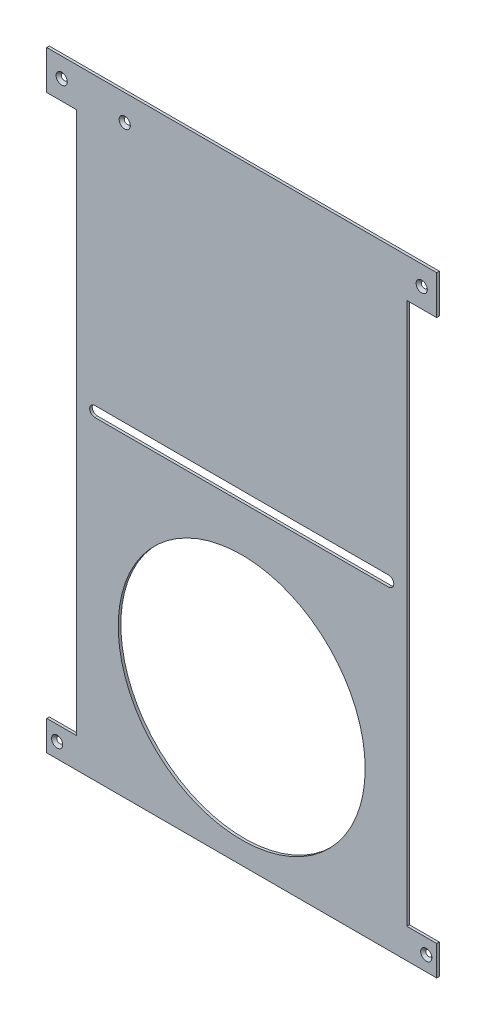
ISO-10303-21;
HEADER;
FILE_DESCRIPTION(('STEP AP214'),'2;1');
FILE_NAME('part.step','',(''),(''),'','','');
FILE_SCHEMA(('AUTOMOTIVE_DESIGN { 1 0 10303 214 1 1 1 1 }'));
ENDSEC;
DATA;
#1=APPLICATION_CONTEXT('core data for automotive mechanical design processes');
#2=APPLICATION_PROTOCOL_DEFINITION('international standard','automotive_design',2000,#1);
#3=PRODUCT_CONTEXT('',#1,'mechanical');
#4=PRODUCT('Part','Part','',(#3));
#5=PRODUCT_RELATED_PRODUCT_CATEGORY('part','',(#4));
#6=PRODUCT_DEFINITION_FORMATION('','',#4);
#7=PRODUCT_DEFINITION_CONTEXT('part definition',#1,'design');
#8=PRODUCT_DEFINITION('design','',#6,#7);
#9=PRODUCT_DEFINITION_SHAPE('','',#8);
#10=(LENGTH_UNIT() NAMED_UNIT(*) SI_UNIT(.MILLI.,.METRE.));
#11=(NAMED_UNIT(*) PLANE_ANGLE_UNIT() SI_UNIT($,.RADIAN.));
#12=(NAMED_UNIT(*) SI_UNIT($,.STERADIAN.) SOLID_ANGLE_UNIT());
#13=UNCERTAINTY_MEASURE_WITH_UNIT(LENGTH_MEASURE(1.E-05),#10,'distance_accuracy_value','');
#14=(GEOMETRIC_REPRESENTATION_CONTEXT(3) GLOBAL_UNCERTAINTY_ASSIGNED_CONTEXT((#13)) GLOBAL_UNIT_ASSIGNED_CONTEXT((#10,
#11,#12)) REPRESENTATION_CONTEXT('',''));
#15=CARTESIAN_POINT('',(0.,0.,0.));
#16=DIRECTION('',(0.,0.,1.));
#17=DIRECTION('',(1.,0.,0.));
#18=AXIS2_PLACEMENT_3D('',#15,#16,#17);
#19=CARTESIAN_POINT('',(0.,0.,0.));
#20=DIRECTION('',(0.,0.,1.));
#21=DIRECTION('',(1.,0.,0.));
#22=AXIS2_PLACEMENT_3D('',#19,#20,#21);
#23=PLANE('',#22);
#24=CARTESIAN_POINT('',(263.,246.,0.));
#25=DIRECTION('',(0.,0.,1.));
#26=DIRECTION('',(1.,0.,0.));
#27=AXIS2_PLACEMENT_3D('',#24,#25,#26);
#28=CIRCLE('',#27,4.);
#29=CARTESIAN_POINT('',(263.,242.,0.));
#30=VERTEX_POINT('',#29);
#31=CARTESIAN_POINT('',(267.,246.,0.));
#32=VERTEX_POINT('',#31);
#33=EDGE_CURVE('E69',#30,#32,#28,.T.);
#34=ORIENTED_EDGE('',*,*,#33,.T.);
#35=CARTESIAN_POINT('',(263.,246.,0.));
#36=DIRECTION('',(0.,0.,1.));
#37=DIRECTION('',(1.,0.,0.));
#38=AXIS2_PLACEMENT_3D('',#35,#36,#37);
#39=CIRCLE('',#38,4.);
#40=CARTESIAN_POINT('',(263.,250.,0.));
#41=VERTEX_POINT('',#40);
#42=EDGE_CURVE('E55',#32,#41,#39,.T.);
#43=ORIENTED_EDGE('',*,*,#42,.T.);
#44=DIRECTION('',(1.,0.,0.));
#45=VECTOR('',#44,1.);
#46=CARTESIAN_POINT('',(267.,250.,0.));
#47=LINE('',#46,#45);
#48=CARTESIAN_POINT('',(37.,250.,0.));
#49=VERTEX_POINT('',#48);
#50=EDGE_CURVE('E285',#49,#41,#47,.T.);
#51=ORIENTED_EDGE('',*,*,#50,.F.);
#52=CARTESIAN_POINT('',(37.,246.,0.));
#53=DIRECTION('',(0.,0.,1.));
#54=DIRECTION('',(1.,0.,0.));
#55=AXIS2_PLACEMENT_3D('',#52,#53,#54);
#56=CIRCLE('',#55,4.);
#57=CARTESIAN_POINT('',(32.9999999999999,246.,0.));
#58=VERTEX_POINT('',#57);
#59=EDGE_CURVE('E319',#49,#58,#56,.T.);
#60=ORIENTED_EDGE('',*,*,#59,.T.);
#61=CARTESIAN_POINT('',(37.,246.,0.));
#62=DIRECTION('',(0.,0.,1.));
#63=DIRECTION('',(1.,0.,0.));
#64=AXIS2_PLACEMENT_3D('',#61,#62,#63);
#65=CIRCLE('',#64,4.);
#66=CARTESIAN_POINT('',(37.,242.,0.));
#67=VERTEX_POINT('',#66);
#68=EDGE_CURVE('E325',#58,#67,#65,.T.);
#69=ORIENTED_EDGE('',*,*,#68,.T.);
#70=DIRECTION('',(-1.,0.,0.));
#71=VECTOR('',#70,1.);
#72=CARTESIAN_POINT('',(267.,242.,0.));
#73=LINE('',#72,#71);
#74=EDGE_CURVE('E278',#30,#67,#73,.T.);
#75=ORIENTED_EDGE('',*,*,#74,.F.);
#76=EDGE_LOOP('',(#34,#43,#51,#60,#69,#75));
#77=FACE_BOUND('',#76,.T.);
#78=CARTESIAN_POINT('',(60.,450.,0.));
#79=DIRECTION('',(0.,0.,1.));
#80=DIRECTION('',(1.,0.,0.));
#81=AXIS2_PLACEMENT_3D('',#78,#79,#80);
#82=CIRCLE('',#81,2.3);
#83=CARTESIAN_POINT('',(62.3,450.,0.));
#84=VERTEX_POINT('',#83);
#85=EDGE_CURVE('E310',#84,#84,#82,.T.);
#86=ORIENTED_EDGE('',*,*,#85,.T.);
#87=EDGE_LOOP('',(#86));
#88=FACE_BOUND('',#87,.T.);
#89=CARTESIAN_POINT('',(150.,112.,0.));
#90=DIRECTION('',(0.,0.,1.));
#91=DIRECTION('',(1.,0.,0.));
#92=AXIS2_PLACEMENT_3D('',#89,#90,#91);
#93=CIRCLE('',#92,95.);
#94=CARTESIAN_POINT('',(245.,112.,0.));
#95=VERTEX_POINT('',#94);
#96=EDGE_CURVE('E347',#95,#95,#93,.T.);
#97=ORIENTED_EDGE('',*,*,#96,.T.);
#98=EDGE_LOOP('',(#97));
#99=FACE_BOUND('',#98,.T.);
#100=CARTESIAN_POINT('',(292.,11.5,0.));
#101=DIRECTION('',(0.,0.,1.));
#102=DIRECTION('',(1.,0.,0.));
#103=AXIS2_PLACEMENT_3D('',#100,#101,#102);
#104=CIRCLE('',#103,2.29999999999997);
#105=CARTESIAN_POINT('',(294.3,11.5,0.));
#106=VERTEX_POINT('',#105);
#107=EDGE_CURVE('E354',#106,#106,#104,.T.);
#108=ORIENTED_EDGE('',*,*,#107,.T.);
#109=EDGE_LOOP('',(#108));
#110=FACE_BOUND('',#109,.T.);
#111=CARTESIAN_POINT('',(8.,11.5,0.));
#112=DIRECTION('',(0.,0.,1.));
#113=DIRECTION('',(1.,0.,0.));
#114=AXIS2_PLACEMENT_3D('',#111,#112,#113);
#115=CIRCLE('',#114,2.3);
#116=CARTESIAN_POINT('',(10.3,11.5,0.));
#117=VERTEX_POINT('',#116);
#118=EDGE_CURVE('E218',#117,#117,#115,.T.);
#119=ORIENTED_EDGE('',*,*,#118,.T.);
#120=EDGE_LOOP('',(#119));
#121=FACE_BOUND('',#120,.T.);
#122=CARTESIAN_POINT('',(11.4999999999999,455.,0.));
#123=DIRECTION('',(0.,0.,1.));
#124=DIRECTION('',(1.,0.,0.));
#125=AXIS2_PLACEMENT_3D('',#122,#123,#124);
#126=CIRCLE('',#125,2.3);
#127=CARTESIAN_POINT('',(13.7999999999999,455.,0.));
#128=VERTEX_POINT('',#127);
#129=EDGE_CURVE('E211',#128,#128,#126,.T.);
#130=ORIENTED_EDGE('',*,*,#129,.T.);
#131=EDGE_LOOP('',(#130));
#132=FACE_BOUND('',#131,.T.);
#133=CARTESIAN_POINT('',(288.5,455.,0.));
#134=DIRECTION('',(0.,0.,1.));
#135=DIRECTION('',(1.,0.,0.));
#136=AXIS2_PLACEMENT_3D('',#133,#134,#135);
#137=CIRCLE('',#136,2.29999999999997);
#138=CARTESIAN_POINT('',(290.8,455.,0.));
#139=VERTEX_POINT('',#138);
#140=EDGE_CURVE('E233',#139,#139,#137,.T.);
#141=ORIENTED_EDGE('',*,*,#140,.T.);
#142=EDGE_LOOP('',(#141));
#143=FACE_BOUND('',#142,.T.);
#144=DIRECTION('',(0.,-1.,0.));
#145=VECTOR('',#144,1.);
#146=CARTESIAN_POINT('',(0.,0.,0.));
#147=LINE('',#146,#145);
#148=CARTESIAN_POINT('',(0.,23.,0.));
#149=VERTEX_POINT('',#148);
#150=CARTESIAN_POINT('',(0.,0.,0.));
#151=VERTEX_POINT('',#150);
#152=EDGE_CURVE('E198',#149,#151,#147,.T.);
#153=ORIENTED_EDGE('',*,*,#152,.F.);
#154=DIRECTION('',(-1.,0.,0.));
#155=VECTOR('',#154,1.);
#156=CARTESIAN_POINT('',(23.,23.,0.));
#157=LINE('',#156,#155);
#158=CARTESIAN_POINT('',(23.,23.,0.));
#159=VERTEX_POINT('',#158);
#160=EDGE_CURVE('E194',#159,#149,#157,.T.);
#161=ORIENTED_EDGE('',*,*,#160,.F.);
#162=DIRECTION('',(0.,-1.,0.));
#163=VECTOR('',#162,1.);
#164=CARTESIAN_POINT('',(22.9999999999999,440.,0.));
#165=LINE('',#164,#163);
#166=CARTESIAN_POINT('',(22.9999999999999,440.,0.));
#167=VERTEX_POINT('',#166);
#168=EDGE_CURVE('E711',#167,#159,#165,.T.);
#169=ORIENTED_EDGE('',*,*,#168,.F.);
#170=DIRECTION('',(1.,0.,0.));
#171=VECTOR('',#170,1.);
#172=CARTESIAN_POINT('',(0.,440.,0.));
#173=LINE('',#172,#171);
#174=CARTESIAN_POINT('',(0.,440.,0.));
#175=VERTEX_POINT('',#174);
#176=EDGE_CURVE('E708',#175,#167,#173,.T.);
#177=ORIENTED_EDGE('',*,*,#176,.F.);
#178=DIRECTION('',(0.,-1.,0.));
#179=VECTOR('',#178,1.);
#180=CARTESIAN_POINT('',(0.,470.,0.));
#181=LINE('',#180,#179);
#182=CARTESIAN_POINT('',(0.,470.,0.));
#183=VERTEX_POINT('',#182);
#184=EDGE_CURVE('E705',#183,#175,#181,.T.);
#185=ORIENTED_EDGE('',*,*,#184,.F.);
#186=DIRECTION('',(-1.,0.,0.));
#187=VECTOR('',#186,1.);
#188=CARTESIAN_POINT('',(0.,470.,0.));
#189=LINE('',#188,#187);
#190=CARTESIAN_POINT('',(300.,470.,0.));
#191=VERTEX_POINT('',#190);
#192=EDGE_CURVE('E702',#191,#183,#189,.T.);
#193=ORIENTED_EDGE('',*,*,#192,.F.);
#194=DIRECTION('',(0.,1.,0.));
#195=VECTOR('',#194,1.);
#196=CARTESIAN_POINT('',(300.,440.,0.));
#197=LINE('',#196,#195);
#198=CARTESIAN_POINT('',(300.,440.,0.));
#199=VERTEX_POINT('',#198);
#200=EDGE_CURVE('E699',#199,#191,#197,.T.);
#201=ORIENTED_EDGE('',*,*,#200,.F.);
#202=DIRECTION('',(1.,0.,0.));
#203=VECTOR('',#202,1.);
#204=CARTESIAN_POINT('',(277.,440.,0.));
#205=LINE('',#204,#203);
#206=CARTESIAN_POINT('',(277.,440.,0.));
#207=VERTEX_POINT('',#206);
#208=EDGE_CURVE('E696',#207,#199,#205,.T.);
#209=ORIENTED_EDGE('',*,*,#208,.F.);
#210=DIRECTION('',(0.,1.,0.));
#211=VECTOR('',#210,1.);
#212=CARTESIAN_POINT('',(277.,23.,0.));
#213=LINE('',#212,#211);
#214=CARTESIAN_POINT('',(277.,23.,0.));
#215=VERTEX_POINT('',#214);
#216=EDGE_CURVE('E694',#215,#207,#213,.T.);
#217=ORIENTED_EDGE('',*,*,#216,.F.);
#218=DIRECTION('',(-1.,0.,0.));
#219=VECTOR('',#218,1.);
#220=CARTESIAN_POINT('',(300.,23.,0.));
#221=LINE('',#220,#219);
#222=CARTESIAN_POINT('',(300.,23.,0.));
#223=VERTEX_POINT('',#222);
#224=EDGE_CURVE('E692',#223,#215,#221,.T.);
#225=ORIENTED_EDGE('',*,*,#224,.F.);
#226=DIRECTION('',(0.,1.,0.));
#227=VECTOR('',#226,1.);
#228=CARTESIAN_POINT('',(300.,0.,0.));
#229=LINE('',#228,#227);
#230=CARTESIAN_POINT('',(300.,0.,0.));
#231=VERTEX_POINT('',#230);
#232=EDGE_CURVE('E253',#231,#223,#229,.T.);
#233=ORIENTED_EDGE('',*,*,#232,.F.);
#234=DIRECTION('',(1.,0.,0.));
#235=VECTOR('',#234,1.);
#236=CARTESIAN_POINT('',(0.,0.,0.));
#237=LINE('',#236,#235);
#238=EDGE_CURVE('E247',#151,#231,#237,.T.);
#239=ORIENTED_EDGE('',*,*,#238,.F.);
#240=EDGE_LOOP('',(#153,#161,#169,#177,#185,#193,#201,#209,#217,#225,#233,#239));
#241=FACE_BOUND('',#240,.T.);
#242=ADVANCED_FACE('F45',(#77,#88,#99,#110,#121,#132,#143,#241),#23,.F.);
#243=CARTESIAN_POINT('',(0.,0.,2.));
#244=DIRECTION('',(1.,0.,0.));
#245=DIRECTION('',(0.,0.,-1.));
#246=AXIS2_PLACEMENT_3D('',#243,#244,#245);
#247=PLANE('',#246);
#248=ORIENTED_EDGE('',*,*,#152,.T.);
#249=DIRECTION('',(0.,0.,-1.));
#250=VECTOR('',#249,1.);
#251=CARTESIAN_POINT('',(0.,0.,2.));
#252=LINE('',#251,#250);
#253=CARTESIAN_POINT('',(0.,0.,2.));
#254=VERTEX_POINT('',#253);
#255=EDGE_CURVE('E176',#254,#151,#252,.T.);
#256=ORIENTED_EDGE('',*,*,#255,.F.);
#257=DIRECTION('',(0.,-1.,0.));
#258=VECTOR('',#257,1.);
#259=CARTESIAN_POINT('',(0.,0.,2.));
#260=LINE('',#259,#258);
#261=CARTESIAN_POINT('',(0.,23.,2.));
#262=VERTEX_POINT('',#261);
#263=EDGE_CURVE('E184',#262,#254,#260,.T.);
#264=ORIENTED_EDGE('',*,*,#263,.F.);
#265=DIRECTION('',(0.,0.,-1.));
#266=VECTOR('',#265,1.);
#267=CARTESIAN_POINT('',(0.,23.,2.));
#268=LINE('',#267,#266);
#269=EDGE_CURVE('E742',#262,#149,#268,.T.);
#270=ORIENTED_EDGE('',*,*,#269,.T.);
#271=EDGE_LOOP('',(#248,#256,#264,#270));
#272=FACE_BOUND('',#271,.T.);
#273=ADVANCED_FACE('F196',(#272),#247,.F.);
#274=CARTESIAN_POINT('',(0.,0.,2.));
#275=DIRECTION('',(0.,1.,0.));
#276=DIRECTION('',(-1.,0.,0.));
#277=AXIS2_PLACEMENT_3D('',#274,#275,#276);
#278=PLANE('',#277);
#279=ORIENTED_EDGE('',*,*,#238,.T.);
#280=DIRECTION('',(0.,0.,-1.));
#281=VECTOR('',#280,1.);
#282=CARTESIAN_POINT('',(300.,0.,2.));
#283=LINE('',#282,#281);
#284=CARTESIAN_POINT('',(300.,0.,2.));
#285=VERTEX_POINT('',#284);
#286=EDGE_CURVE('E179',#285,#231,#283,.T.);
#287=ORIENTED_EDGE('',*,*,#286,.F.);
#288=DIRECTION('',(1.,0.,0.));
#289=VECTOR('',#288,1.);
#290=CARTESIAN_POINT('',(0.,0.,2.));
#291=LINE('',#290,#289);
#292=EDGE_CURVE('E172',#254,#285,#291,.T.);
#293=ORIENTED_EDGE('',*,*,#292,.F.);
#294=ORIENTED_EDGE('',*,*,#255,.T.);
#295=EDGE_LOOP('',(#279,#287,#293,#294));
#296=FACE_BOUND('',#295,.T.);
#297=ADVANCED_FACE('F174',(#296),#278,.F.);
#298=CARTESIAN_POINT('',(300.,0.,2.));
#299=DIRECTION('',(-1.,0.,0.));
#300=DIRECTION('',(0.,0.,1.));
#301=AXIS2_PLACEMENT_3D('',#298,#299,#300);
#302=PLANE('',#301);
#303=ORIENTED_EDGE('',*,*,#232,.T.);
#304=DIRECTION('',(0.,0.,-1.));
#305=VECTOR('',#304,1.);
#306=CARTESIAN_POINT('',(300.,23.,2.));
#307=LINE('',#306,#305);
#308=CARTESIAN_POINT('',(300.,23.,2.));
#309=VERTEX_POINT('',#308);
#310=EDGE_CURVE('E207',#309,#223,#307,.T.);
#311=ORIENTED_EDGE('',*,*,#310,.F.);
#312=DIRECTION('',(0.,1.,0.));
#313=VECTOR('',#312,1.);
#314=CARTESIAN_POINT('',(300.,0.,2.));
#315=LINE('',#314,#313);
#316=EDGE_CURVE('E183',#285,#309,#315,.T.);
#317=ORIENTED_EDGE('',*,*,#316,.F.);
#318=ORIENTED_EDGE('',*,*,#286,.T.);
#319=EDGE_LOOP('',(#303,#311,#317,#318));
#320=FACE_BOUND('',#319,.T.);
#321=ADVANCED_FACE('F442',(#320),#302,.F.);
#322=CARTESIAN_POINT('',(300.,23.,2.));
#323=DIRECTION('',(0.,-1.,0.));
#324=DIRECTION('',(1.,0.,0.));
#325=AXIS2_PLACEMENT_3D('',#322,#323,#324);
#326=PLANE('',#325);
#327=ORIENTED_EDGE('',*,*,#224,.T.);
#328=DIRECTION('',(0.,0.,-1.));
#329=VECTOR('',#328,1.);
#330=CARTESIAN_POINT('',(277.,23.,2.));
#331=LINE('',#330,#329);
#332=CARTESIAN_POINT('',(277.,23.,2.));
#333=VERTEX_POINT('',#332);
#334=EDGE_CURVE('E772',#333,#215,#331,.T.);
#335=ORIENTED_EDGE('',*,*,#334,.F.);
#336=DIRECTION('',(-1.,0.,0.));
#337=VECTOR('',#336,1.);
#338=CARTESIAN_POINT('',(300.,23.,2.));
#339=LINE('',#338,#337);
#340=EDGE_CURVE('E717',#309,#333,#339,.T.);
#341=ORIENTED_EDGE('',*,*,#340,.F.);
#342=ORIENTED_EDGE('',*,*,#310,.T.);
#343=EDGE_LOOP('',(#327,#335,#341,#342));
#344=FACE_BOUND('',#343,.T.);
#345=ADVANCED_FACE('F438',(#344),#326,.F.);
#346=CARTESIAN_POINT('',(277.,23.,2.));
#347=DIRECTION('',(-1.,0.,0.));
#348=DIRECTION('',(0.,0.,1.));
#349=AXIS2_PLACEMENT_3D('',#346,#347,#348);
#350=PLANE('',#349);
#351=ORIENTED_EDGE('',*,*,#216,.T.);
#352=DIRECTION('',(0.,0.,-1.));
#353=VECTOR('',#352,1.);
#354=CARTESIAN_POINT('',(277.,440.,2.));
#355=LINE('',#354,#353);
#356=CARTESIAN_POINT('',(277.,440.,2.));
#357=VERTEX_POINT('',#356);
#358=EDGE_CURVE('E768',#357,#207,#355,.T.);
#359=ORIENTED_EDGE('',*,*,#358,.F.);
#360=DIRECTION('',(0.,1.,0.));
#361=VECTOR('',#360,1.);
#362=CARTESIAN_POINT('',(277.,23.,2.));
#363=LINE('',#362,#361);
#364=EDGE_CURVE('E720',#333,#357,#363,.T.);
#365=ORIENTED_EDGE('',*,*,#364,.F.);
#366=ORIENTED_EDGE('',*,*,#334,.T.);
#367=EDGE_LOOP('',(#351,#359,#365,#366));
#368=FACE_BOUND('',#367,.T.);
#369=ADVANCED_FACE('F434',(#368),#350,.F.);
#370=CARTESIAN_POINT('',(277.,440.,2.));
#371=DIRECTION('',(0.,1.,0.));
#372=DIRECTION('',(0.,0.,1.));
#373=AXIS2_PLACEMENT_3D('',#370,#371,#372);
#374=PLANE('',#373);
#375=ORIENTED_EDGE('',*,*,#208,.T.);
#376=DIRECTION('',(0.,0.,-1.));
#377=VECTOR('',#376,1.);
#378=CARTESIAN_POINT('',(300.,440.,2.));
#379=LINE('',#378,#377);
#380=CARTESIAN_POINT('',(300.,440.,2.));
#381=VERTEX_POINT('',#380);
#382=EDGE_CURVE('E764',#381,#199,#379,.T.);
#383=ORIENTED_EDGE('',*,*,#382,.F.);
#384=DIRECTION('',(1.,0.,0.));
#385=VECTOR('',#384,1.);
#386=CARTESIAN_POINT('',(277.,440.,2.));
#387=LINE('',#386,#385);
#388=EDGE_CURVE('E723',#357,#381,#387,.T.);
#389=ORIENTED_EDGE('',*,*,#388,.F.);
#390=ORIENTED_EDGE('',*,*,#358,.T.);
#391=EDGE_LOOP('',(#375,#383,#389,#390));
#392=FACE_BOUND('',#391,.T.);
#393=ADVANCED_FACE('F430',(#392),#374,.F.);
#394=CARTESIAN_POINT('',(300.,440.,2.));
#395=DIRECTION('',(-1.,0.,0.));
#396=DIRECTION('',(0.,0.,1.));
#397=AXIS2_PLACEMENT_3D('',#394,#395,#396);
#398=PLANE('',#397);
#399=ORIENTED_EDGE('',*,*,#200,.T.);
#400=DIRECTION('',(0.,0.,-1.));
#401=VECTOR('',#400,1.);
#402=CARTESIAN_POINT('',(300.,470.,2.));
#403=LINE('',#402,#401);
#404=CARTESIAN_POINT('',(300.,470.,2.));
#405=VERTEX_POINT('',#404);
#406=EDGE_CURVE('E760',#405,#191,#403,.T.);
#407=ORIENTED_EDGE('',*,*,#406,.F.);
#408=DIRECTION('',(0.,1.,0.));
#409=VECTOR('',#408,1.);
#410=CARTESIAN_POINT('',(300.,440.,2.));
#411=LINE('',#410,#409);
#412=EDGE_CURVE('E726',#381,#405,#411,.T.);
#413=ORIENTED_EDGE('',*,*,#412,.F.);
#414=ORIENTED_EDGE('',*,*,#382,.T.);
#415=EDGE_LOOP('',(#399,#407,#413,#414));
#416=FACE_BOUND('',#415,.T.);
#417=ADVANCED_FACE('F426',(#416),#398,.F.);
#418=CARTESIAN_POINT('',(0.,470.,2.));
#419=DIRECTION('',(0.,-1.,0.));
#420=DIRECTION('',(0.,0.,-1.));
#421=AXIS2_PLACEMENT_3D('',#418,#419,#420);
#422=PLANE('',#421);
#423=ORIENTED_EDGE('',*,*,#192,.T.);
#424=DIRECTION('',(0.,0.,-1.));
#425=VECTOR('',#424,1.);
#426=CARTESIAN_POINT('',(0.,470.,2.));
#427=LINE('',#426,#425);
#428=CARTESIAN_POINT('',(0.,470.,2.));
#429=VERTEX_POINT('',#428);
#430=EDGE_CURVE('E756',#429,#183,#427,.T.);
#431=ORIENTED_EDGE('',*,*,#430,.F.);
#432=DIRECTION('',(-1.,0.,0.));
#433=VECTOR('',#432,1.);
#434=CARTESIAN_POINT('',(0.,470.,2.));
#435=LINE('',#434,#433);
#436=EDGE_CURVE('E729',#405,#429,#435,.T.);
#437=ORIENTED_EDGE('',*,*,#436,.F.);
#438=ORIENTED_EDGE('',*,*,#406,.T.);
#439=EDGE_LOOP('',(#423,#431,#437,#438));
#440=FACE_BOUND('',#439,.T.);
#441=ADVANCED_FACE('F422',(#440),#422,.F.);
#442=CARTESIAN_POINT('',(0.,470.,2.));
#443=DIRECTION('',(1.,0.,0.));
#444=DIRECTION('',(0.,1.,0.));
#445=AXIS2_PLACEMENT_3D('',#442,#443,#444);
#446=PLANE('',#445);
#447=ORIENTED_EDGE('',*,*,#184,.T.);
#448=DIRECTION('',(0.,0.,-1.));
#449=VECTOR('',#448,1.);
#450=CARTESIAN_POINT('',(0.,440.,2.));
#451=LINE('',#450,#449);
#452=CARTESIAN_POINT('',(0.,440.,2.));
#453=VERTEX_POINT('',#452);
#454=EDGE_CURVE('E752',#453,#175,#451,.T.);
#455=ORIENTED_EDGE('',*,*,#454,.F.);
#456=DIRECTION('',(0.,-1.,0.));
#457=VECTOR('',#456,1.);
#458=CARTESIAN_POINT('',(0.,470.,2.));
#459=LINE('',#458,#457);
#460=EDGE_CURVE('E732',#429,#453,#459,.T.);
#461=ORIENTED_EDGE('',*,*,#460,.F.);
#462=ORIENTED_EDGE('',*,*,#430,.T.);
#463=EDGE_LOOP('',(#447,#455,#461,#462));
#464=FACE_BOUND('',#463,.T.);
#465=ADVANCED_FACE('F418',(#464),#446,.F.);
#466=CARTESIAN_POINT('',(0.,440.,2.));
#467=DIRECTION('',(0.,1.,0.));
#468=DIRECTION('',(0.,0.,1.));
#469=AXIS2_PLACEMENT_3D('',#466,#467,#468);
#470=PLANE('',#469);
#471=ORIENTED_EDGE('',*,*,#176,.T.);
#472=DIRECTION('',(0.,0.,-1.));
#473=VECTOR('',#472,1.);
#474=CARTESIAN_POINT('',(22.9999999999999,440.,2.));
#475=LINE('',#474,#473);
#476=CARTESIAN_POINT('',(22.9999999999999,440.,2.));
#477=VERTEX_POINT('',#476);
#478=EDGE_CURVE('E748',#477,#167,#475,.T.);
#479=ORIENTED_EDGE('',*,*,#478,.F.);
#480=DIRECTION('',(1.,0.,0.));
#481=VECTOR('',#480,1.);
#482=CARTESIAN_POINT('',(0.,440.,2.));
#483=LINE('',#482,#481);
#484=EDGE_CURVE('E735',#453,#477,#483,.T.);
#485=ORIENTED_EDGE('',*,*,#484,.F.);
#486=ORIENTED_EDGE('',*,*,#454,.T.);
#487=EDGE_LOOP('',(#471,#479,#485,#486));
#488=FACE_BOUND('',#487,.T.);
#489=ADVANCED_FACE('F414',(#488),#470,.F.);
#490=CARTESIAN_POINT('',(22.9999999999999,440.,2.));
#491=DIRECTION('',(1.,0.,0.));
#492=DIRECTION('',(0.,1.,0.));
#493=AXIS2_PLACEMENT_3D('',#490,#491,#492);
#494=PLANE('',#493);
#495=ORIENTED_EDGE('',*,*,#168,.T.);
#496=DIRECTION('',(0.,0.,-1.));
#497=VECTOR('',#496,1.);
#498=CARTESIAN_POINT('',(23.,23.,2.));
#499=LINE('',#498,#497);
#500=CARTESIAN_POINT('',(23.,23.,2.));
#501=VERTEX_POINT('',#500);
#502=EDGE_CURVE('E744',#501,#159,#499,.T.);
#503=ORIENTED_EDGE('',*,*,#502,.F.);
#504=DIRECTION('',(0.,-1.,0.));
#505=VECTOR('',#504,1.);
#506=CARTESIAN_POINT('',(22.9999999999999,440.,2.));
#507=LINE('',#506,#505);
#508=EDGE_CURVE('E738',#477,#501,#507,.T.);
#509=ORIENTED_EDGE('',*,*,#508,.F.);
#510=ORIENTED_EDGE('',*,*,#478,.T.);
#511=EDGE_LOOP('',(#495,#503,#509,#510));
#512=FACE_BOUND('',#511,.T.);
#513=ADVANCED_FACE('F410',(#512),#494,.F.);
#514=CARTESIAN_POINT('',(23.,23.,2.));
#515=DIRECTION('',(0.,-1.,0.));
#516=DIRECTION('',(1.,0.,0.));
#517=AXIS2_PLACEMENT_3D('',#514,#515,#516);
#518=PLANE('',#517);
#519=ORIENTED_EDGE('',*,*,#160,.T.);
#520=ORIENTED_EDGE('',*,*,#269,.F.);
#521=DIRECTION('',(-1.,0.,0.));
#522=VECTOR('',#521,1.);
#523=CARTESIAN_POINT('',(23.,23.,2.));
#524=LINE('',#523,#522);
#525=EDGE_CURVE('E189',#501,#262,#524,.T.);
#526=ORIENTED_EDGE('',*,*,#525,.F.);
#527=ORIENTED_EDGE('',*,*,#502,.T.);
#528=EDGE_LOOP('',(#519,#520,#526,#527));
#529=FACE_BOUND('',#528,.T.);
#530=ADVANCED_FACE('F407',(#529),#518,.F.);
#531=CARTESIAN_POINT('',(0.,0.,2.));
#532=DIRECTION('',(0.,0.,1.));
#533=DIRECTION('',(1.,0.,0.));
#534=AXIS2_PLACEMENT_3D('',#531,#532,#533);
#535=PLANE('',#534);
#536=DIRECTION('',(-1.,0.,0.));
#537=VECTOR('',#536,1.);
#538=CARTESIAN_POINT('',(0.,250.,2.));
#539=LINE('',#538,#537);
#540=CARTESIAN_POINT('',(263.,250.,2.));
#541=VERTEX_POINT('',#540);
#542=CARTESIAN_POINT('',(37.,250.,2.));
#543=VERTEX_POINT('',#542);
#544=EDGE_CURVE('E205',#541,#543,#539,.T.);
#545=ORIENTED_EDGE('',*,*,#544,.F.);
#546=CARTESIAN_POINT('',(263.,246.,2.));
#547=DIRECTION('',(0.,0.,1.));
#548=DIRECTION('',(1.,0.,0.));
#549=AXIS2_PLACEMENT_3D('',#546,#547,#548);
#550=CIRCLE('',#549,4.);
#551=CARTESIAN_POINT('',(267.,246.,2.));
#552=VERTEX_POINT('',#551);
#553=EDGE_CURVE('E12',#541,#552,#550,.F.);
#554=ORIENTED_EDGE('',*,*,#553,.T.);
#555=CARTESIAN_POINT('',(263.,246.,2.));
#556=DIRECTION('',(0.,0.,1.));
#557=DIRECTION('',(1.,0.,0.));
#558=AXIS2_PLACEMENT_3D('',#555,#556,#557);
#559=CIRCLE('',#558,4.);
#560=CARTESIAN_POINT('',(263.,242.,2.));
#561=VERTEX_POINT('',#560);
#562=EDGE_CURVE('E269',#552,#561,#559,.F.);
#563=ORIENTED_EDGE('',*,*,#562,.T.);
#564=DIRECTION('',(1.,0.,0.));
#565=VECTOR('',#564,1.);
#566=CARTESIAN_POINT('',(0.,242.,2.));
#567=LINE('',#566,#565);
#568=CARTESIAN_POINT('',(37.,242.,2.));
#569=VERTEX_POINT('',#568);
#570=EDGE_CURVE('E200',#569,#561,#567,.T.);
#571=ORIENTED_EDGE('',*,*,#570,.F.);
#572=CARTESIAN_POINT('',(37.,246.,2.));
#573=DIRECTION('',(0.,0.,1.));
#574=DIRECTION('',(1.,0.,0.));
#575=AXIS2_PLACEMENT_3D('',#572,#573,#574);
#576=CIRCLE('',#575,4.);
#577=CARTESIAN_POINT('',(32.9999999999999,246.,2.));
#578=VERTEX_POINT('',#577);
#579=EDGE_CURVE('E323',#569,#578,#576,.F.);
#580=ORIENTED_EDGE('',*,*,#579,.T.);
#581=CARTESIAN_POINT('',(37.,246.,2.));
#582=DIRECTION('',(0.,0.,1.));
#583=DIRECTION('',(1.,0.,0.));
#584=AXIS2_PLACEMENT_3D('',#581,#582,#583);
#585=CIRCLE('',#584,4.);
#586=EDGE_CURVE('E270',#578,#543,#585,.F.);
#587=ORIENTED_EDGE('',*,*,#586,.T.);
#588=EDGE_LOOP('',(#545,#554,#563,#571,#580,#587));
#589=FACE_BOUND('',#588,.T.);
#590=CARTESIAN_POINT('',(60.,450.,2.));
#591=DIRECTION('',(0.,0.,1.));
#592=DIRECTION('',(1.,0.,0.));
#593=AXIS2_PLACEMENT_3D('',#590,#591,#592);
#594=CIRCLE('',#593,4.3);
#595=CARTESIAN_POINT('',(64.3,450.,2.));
#596=VERTEX_POINT('',#595);
#597=EDGE_CURVE('E306',#596,#596,#594,.T.);
#598=ORIENTED_EDGE('',*,*,#597,.F.);
#599=EDGE_LOOP('',(#598));
#600=FACE_BOUND('',#599,.T.);
#601=CARTESIAN_POINT('',(150.,112.,2.));
#602=DIRECTION('',(0.,0.,1.));
#603=DIRECTION('',(1.,0.,0.));
#604=AXIS2_PLACEMENT_3D('',#601,#602,#603);
#605=CIRCLE('',#604,95.);
#606=CARTESIAN_POINT('',(245.,112.,2.));
#607=VERTEX_POINT('',#606);
#608=EDGE_CURVE('E346',#607,#607,#605,.T.);
#609=ORIENTED_EDGE('',*,*,#608,.F.);
#610=EDGE_LOOP('',(#609));
#611=FACE_BOUND('',#610,.T.);
#612=CARTESIAN_POINT('',(292.,11.5,2.));
#613=DIRECTION('',(0.,0.,1.));
#614=DIRECTION('',(1.,0.,0.));
#615=AXIS2_PLACEMENT_3D('',#612,#613,#614);
#616=CIRCLE('',#615,4.30000000000003);
#617=CARTESIAN_POINT('',(296.3,11.5,2.));
#618=VERTEX_POINT('',#617);
#619=EDGE_CURVE('E359',#618,#618,#616,.T.);
#620=ORIENTED_EDGE('',*,*,#619,.F.);
#621=EDGE_LOOP('',(#620));
#622=FACE_BOUND('',#621,.T.);
#623=CARTESIAN_POINT('',(8.,11.5,2.));
#624=DIRECTION('',(0.,0.,1.));
#625=DIRECTION('',(1.,0.,0.));
#626=AXIS2_PLACEMENT_3D('',#623,#624,#625);
#627=CIRCLE('',#626,4.3);
#628=CARTESIAN_POINT('',(12.3,11.5,2.));
#629=VERTEX_POINT('',#628);
#630=EDGE_CURVE('E358',#629,#629,#627,.T.);
#631=ORIENTED_EDGE('',*,*,#630,.F.);
#632=EDGE_LOOP('',(#631));
#633=FACE_BOUND('',#632,.T.);
#634=CARTESIAN_POINT('',(11.4999999999999,455.,2.));
#635=DIRECTION('',(0.,0.,1.));
#636=DIRECTION('',(1.,0.,0.));
#637=AXIS2_PLACEMENT_3D('',#634,#635,#636);
#638=CIRCLE('',#637,4.3);
#639=CARTESIAN_POINT('',(15.7999999999999,455.,2.));
#640=VERTEX_POINT('',#639);
#641=EDGE_CURVE('E217',#640,#640,#638,.T.);
#642=ORIENTED_EDGE('',*,*,#641,.F.);
#643=EDGE_LOOP('',(#642));
#644=FACE_BOUND('',#643,.T.);
#645=CARTESIAN_POINT('',(288.5,455.,2.));
#646=DIRECTION('',(0.,0.,1.));
#647=DIRECTION('',(1.,0.,0.));
#648=AXIS2_PLACEMENT_3D('',#645,#646,#647);
#649=CIRCLE('',#648,4.30000000000003);
#650=CARTESIAN_POINT('',(292.8,455.,2.));
#651=VERTEX_POINT('',#650);
#652=EDGE_CURVE('E216',#651,#651,#649,.T.);
#653=ORIENTED_EDGE('',*,*,#652,.F.);
#654=EDGE_LOOP('',(#653));
#655=FACE_BOUND('',#654,.T.);
#656=ORIENTED_EDGE('',*,*,#263,.T.);
#657=ORIENTED_EDGE('',*,*,#292,.T.);
#658=ORIENTED_EDGE('',*,*,#316,.T.);
#659=ORIENTED_EDGE('',*,*,#340,.T.);
#660=ORIENTED_EDGE('',*,*,#364,.T.);
#661=ORIENTED_EDGE('',*,*,#388,.T.);
#662=ORIENTED_EDGE('',*,*,#412,.T.);
#663=ORIENTED_EDGE('',*,*,#436,.T.);
#664=ORIENTED_EDGE('',*,*,#460,.T.);
#665=ORIENTED_EDGE('',*,*,#484,.T.);
#666=ORIENTED_EDGE('',*,*,#508,.T.);
#667=ORIENTED_EDGE('',*,*,#525,.T.);
#668=EDGE_LOOP('',(#656,#657,#658,#659,#660,#661,#662,#663,#664,#665,#666,#667));
#669=FACE_BOUND('',#668,.T.);
#670=ADVANCED_FACE('F187',(#589,#600,#611,#622,#633,#644,#655,#669),#535,.T.);
#671=CARTESIAN_POINT('',(288.5,455.,2.));
#672=DIRECTION('',(0.,0.,1.));
#673=DIRECTION('',(1.,0.,0.));
#674=AXIS2_PLACEMENT_3D('',#671,#672,#673);
#675=CONICAL_SURFACE('',#674,4.30000000000003,0.785398163397461);
#676=ORIENTED_EDGE('',*,*,#652,.T.);
#677=EDGE_LOOP('',(#676));
#678=FACE_BOUND('',#677,.T.);
#679=ORIENTED_EDGE('',*,*,#140,.F.);
#680=EDGE_LOOP('',(#679));
#681=FACE_BOUND('',#680,.T.);
#682=ADVANCED_FACE('F396',(#678,#681),#675,.F.);
#683=CARTESIAN_POINT('',(11.4999999999999,455.,2.));
#684=DIRECTION('',(0.,0.,1.));
#685=DIRECTION('',(1.,0.,0.));
#686=AXIS2_PLACEMENT_3D('',#683,#684,#685);
#687=CONICAL_SURFACE('',#686,4.3,0.785398163397448);
#688=ORIENTED_EDGE('',*,*,#641,.T.);
#689=EDGE_LOOP('',(#688));
#690=FACE_BOUND('',#689,.T.);
#691=ORIENTED_EDGE('',*,*,#129,.F.);
#692=EDGE_LOOP('',(#691));
#693=FACE_BOUND('',#692,.T.);
#694=ADVANCED_FACE('F387',(#690,#693),#687,.F.);
#695=CARTESIAN_POINT('',(8.,11.5,2.));
#696=DIRECTION('',(0.,0.,1.));
#697=DIRECTION('',(1.,0.,0.));
#698=AXIS2_PLACEMENT_3D('',#695,#696,#697);
#699=CONICAL_SURFACE('',#698,4.3,0.785398163397449);
#700=ORIENTED_EDGE('',*,*,#630,.T.);
#701=EDGE_LOOP('',(#700));
#702=FACE_BOUND('',#701,.T.);
#703=ORIENTED_EDGE('',*,*,#118,.F.);
#704=EDGE_LOOP('',(#703));
#705=FACE_BOUND('',#704,.T.);
#706=ADVANCED_FACE('F384',(#702,#705),#699,.F.);
#707=CARTESIAN_POINT('',(292.,11.5,2.));
#708=DIRECTION('',(0.,0.,1.));
#709=DIRECTION('',(1.,0.,0.));
#710=AXIS2_PLACEMENT_3D('',#707,#708,#709);
#711=CONICAL_SURFACE('',#710,4.30000000000003,0.785398163397461);
#712=ORIENTED_EDGE('',*,*,#619,.T.);
#713=EDGE_LOOP('',(#712));
#714=FACE_BOUND('',#713,.T.);
#715=ORIENTED_EDGE('',*,*,#107,.F.);
#716=EDGE_LOOP('',(#715));
#717=FACE_BOUND('',#716,.T.);
#718=ADVANCED_FACE('F386',(#714,#717),#711,.F.);
#719=CARTESIAN_POINT('',(150.,112.,-8.));
#720=DIRECTION('',(0.,0.,1.));
#721=DIRECTION('',(1.,0.,0.));
#722=AXIS2_PLACEMENT_3D('',#719,#720,#721);
#723=CYLINDRICAL_SURFACE('',#722,95.);
#724=ORIENTED_EDGE('',*,*,#608,.T.);
#725=EDGE_LOOP('',(#724));
#726=FACE_BOUND('',#725,.T.);
#727=ORIENTED_EDGE('',*,*,#96,.F.);
#728=EDGE_LOOP('',(#727));
#729=FACE_BOUND('',#728,.T.);
#730=ADVANCED_FACE('F394',(#726,#729),#723,.F.);
#731=CARTESIAN_POINT('',(60.,450.,2.));
#732=DIRECTION('',(0.,0.,1.));
#733=DIRECTION('',(1.,0.,0.));
#734=AXIS2_PLACEMENT_3D('',#731,#732,#733);
#735=CONICAL_SURFACE('',#734,4.3,0.785398163397448);
#736=ORIENTED_EDGE('',*,*,#597,.T.);
#737=EDGE_LOOP('',(#736));
#738=FACE_BOUND('',#737,.T.);
#739=ORIENTED_EDGE('',*,*,#85,.F.);
#740=EDGE_LOOP('',(#739));
#741=FACE_BOUND('',#740,.T.);
#742=ADVANCED_FACE('F483',(#738,#741),#735,.F.);
#743=CARTESIAN_POINT('',(267.,250.,10.));
#744=DIRECTION('',(0.,1.,0.));
#745=DIRECTION('',(-1.,0.,0.));
#746=AXIS2_PLACEMENT_3D('',#743,#744,#745);
#747=PLANE('',#746);
#748=ORIENTED_EDGE('',*,*,#544,.T.);
#749=DIRECTION('',(0.,0.,-1.));
#750=VECTOR('',#749,1.);
#751=CARTESIAN_POINT('',(37.,250.,0.));
#752=LINE('',#751,#750);
#753=EDGE_CURVE('E304',#543,#49,#752,.T.);
#754=ORIENTED_EDGE('',*,*,#753,.T.);
#755=ORIENTED_EDGE('',*,*,#50,.T.);
#756=DIRECTION('',(0.,0.,-1.));
#757=VECTOR('',#756,1.);
#758=CARTESIAN_POINT('',(263.,250.,2.));
#759=LINE('',#758,#757);
#760=EDGE_CURVE('E295',#41,#541,#759,.F.);
#761=ORIENTED_EDGE('',*,*,#760,.T.);
#762=EDGE_LOOP('',(#748,#754,#755,#761));
#763=FACE_BOUND('',#762,.T.);
#764=ADVANCED_FACE('F302',(#763),#747,.F.);
#765=CARTESIAN_POINT('',(267.,242.,10.));
#766=DIRECTION('',(0.,-1.,0.));
#767=DIRECTION('',(0.,0.,-1.));
#768=AXIS2_PLACEMENT_3D('',#765,#766,#767);
#769=PLANE('',#768);
#770=ORIENTED_EDGE('',*,*,#74,.T.);
#771=DIRECTION('',(0.,0.,-1.));
#772=VECTOR('',#771,1.);
#773=CARTESIAN_POINT('',(37.,242.,2.));
#774=LINE('',#773,#772);
#775=EDGE_CURVE('E333',#67,#569,#774,.F.);
#776=ORIENTED_EDGE('',*,*,#775,.T.);
#777=ORIENTED_EDGE('',*,*,#570,.T.);
#778=DIRECTION('',(0.,0.,-1.));
#779=VECTOR('',#778,1.);
#780=CARTESIAN_POINT('',(263.,242.,0.));
#781=LINE('',#780,#779);
#782=EDGE_CURVE('E337',#561,#30,#781,.T.);
#783=ORIENTED_EDGE('',*,*,#782,.T.);
#784=EDGE_LOOP('',(#770,#776,#777,#783));
#785=FACE_BOUND('',#784,.T.);
#786=ADVANCED_FACE('F454',(#785),#769,.F.);
#787=CARTESIAN_POINT('',(37.,246.,10.));
#788=DIRECTION('',(0.,0.,1.));
#789=DIRECTION('',(1.,0.,0.));
#790=AXIS2_PLACEMENT_3D('',#787,#788,#789);
#791=CYLINDRICAL_SURFACE('',#790,4.);
#792=ORIENTED_EDGE('',*,*,#753,.F.);
#793=ORIENTED_EDGE('',*,*,#586,.F.);
#794=DIRECTION('',(0.,0.,-1.));
#795=VECTOR('',#794,1.);
#796=CARTESIAN_POINT('',(32.9999999999999,246.,2.));
#797=LINE('',#796,#795);
#798=EDGE_CURVE('E275',#58,#578,#797,.F.);
#799=ORIENTED_EDGE('',*,*,#798,.F.);
#800=ORIENTED_EDGE('',*,*,#59,.F.);
#801=EDGE_LOOP('',(#792,#793,#799,#800));
#802=FACE_BOUND('',#801,.T.);
#803=ADVANCED_FACE('F452',(#802),#791,.F.);
#804=CARTESIAN_POINT('',(37.,246.,10.));
#805=DIRECTION('',(0.,0.,1.));
#806=DIRECTION('',(1.,0.,0.));
#807=AXIS2_PLACEMENT_3D('',#804,#805,#806);
#808=CYLINDRICAL_SURFACE('',#807,4.);
#809=ORIENTED_EDGE('',*,*,#579,.F.);
#810=ORIENTED_EDGE('',*,*,#775,.F.);
#811=ORIENTED_EDGE('',*,*,#68,.F.);
#812=ORIENTED_EDGE('',*,*,#798,.T.);
#813=EDGE_LOOP('',(#809,#810,#811,#812));
#814=FACE_BOUND('',#813,.T.);
#815=ADVANCED_FACE('F449',(#814),#808,.F.);
#816=CARTESIAN_POINT('',(263.,246.,10.));
#817=DIRECTION('',(0.,0.,1.));
#818=DIRECTION('',(1.,0.,0.));
#819=AXIS2_PLACEMENT_3D('',#816,#817,#818);
#820=CYLINDRICAL_SURFACE('',#819,4.);
#821=DIRECTION('',(0.,0.,-1.));
#822=VECTOR('',#821,1.);
#823=CARTESIAN_POINT('',(267.,246.,0.));
#824=LINE('',#823,#822);
#825=EDGE_CURVE('E49',#552,#32,#824,.T.);
#826=ORIENTED_EDGE('',*,*,#825,.F.);
#827=ORIENTED_EDGE('',*,*,#553,.F.);
#828=ORIENTED_EDGE('',*,*,#760,.F.);
#829=ORIENTED_EDGE('',*,*,#42,.F.);
#830=EDGE_LOOP('',(#826,#827,#828,#829));
#831=FACE_BOUND('',#830,.T.);
#832=ADVANCED_FACE('F47',(#831),#820,.F.);
#833=CARTESIAN_POINT('',(263.,246.,10.));
#834=DIRECTION('',(0.,0.,1.));
#835=DIRECTION('',(1.,0.,0.));
#836=AXIS2_PLACEMENT_3D('',#833,#834,#835);
#837=CYLINDRICAL_SURFACE('',#836,4.);
#838=ORIENTED_EDGE('',*,*,#562,.F.);
#839=ORIENTED_EDGE('',*,*,#825,.T.);
#840=ORIENTED_EDGE('',*,*,#33,.F.);
#841=ORIENTED_EDGE('',*,*,#782,.F.);
#842=EDGE_LOOP('',(#838,#839,#840,#841));
#843=FACE_BOUND('',#842,.T.);
#844=ADVANCED_FACE('F290',(#843),#837,.F.);
#845=CLOSED_SHELL('',(#242,#273,#297,#321,#345,#369,#393,#417,#441,#465,#489,#513,#530,#670,
#682,#694,#706,#718,#730,#742,#764,#786,#803,#815,#832,#844));
#846=MANIFOLD_SOLID_BREP('B2',#845);
#847=ADVANCED_BREP_SHAPE_REPRESENTATION('',(#18,#846),#14);
#848=SHAPE_DEFINITION_REPRESENTATION(#9,#847);
ENDSEC;
END-ISO-10303-21;
